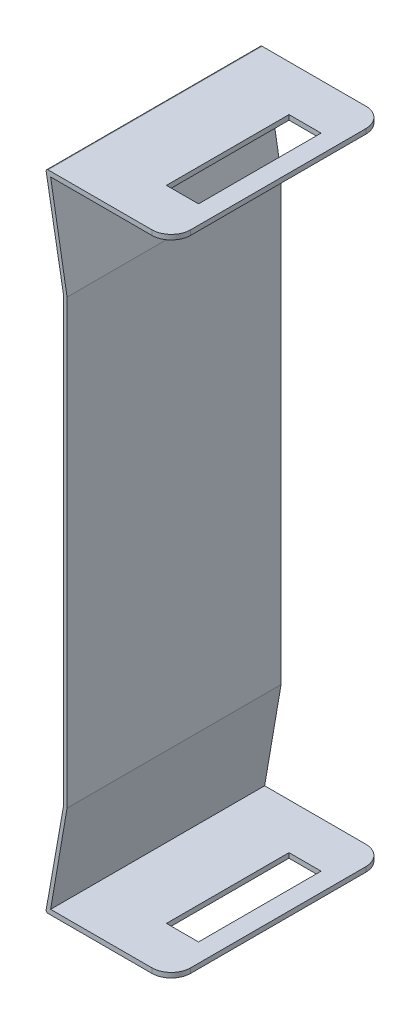
ISO-10303-21;
HEADER;
FILE_DESCRIPTION(('STEP AP214'),'2;1');
FILE_NAME('part.step','',(''),(''),'','','');
FILE_SCHEMA(('AUTOMOTIVE_DESIGN { 1 0 10303 214 1 1 1 1 }'));
ENDSEC;
DATA;
#1=APPLICATION_CONTEXT('core data for automotive mechanical design processes');
#2=APPLICATION_PROTOCOL_DEFINITION('international standard','automotive_design',2000,#1);
#3=PRODUCT_CONTEXT('',#1,'mechanical');
#4=PRODUCT('Part','Part','',(#3));
#5=PRODUCT_RELATED_PRODUCT_CATEGORY('part','',(#4));
#6=PRODUCT_DEFINITION_FORMATION('','',#4);
#7=PRODUCT_DEFINITION_CONTEXT('part definition',#1,'design');
#8=PRODUCT_DEFINITION('design','',#6,#7);
#9=PRODUCT_DEFINITION_SHAPE('','',#8);
#10=(LENGTH_UNIT() NAMED_UNIT(*) SI_UNIT(.MILLI.,.METRE.));
#11=(NAMED_UNIT(*) PLANE_ANGLE_UNIT() SI_UNIT($,.RADIAN.));
#12=(NAMED_UNIT(*) SI_UNIT($,.STERADIAN.) SOLID_ANGLE_UNIT());
#13=UNCERTAINTY_MEASURE_WITH_UNIT(LENGTH_MEASURE(1.E-05),#10,'distance_accuracy_value','');
#14=(GEOMETRIC_REPRESENTATION_CONTEXT(3) GLOBAL_UNCERTAINTY_ASSIGNED_CONTEXT((#13)) GLOBAL_UNIT_ASSIGNED_CONTEXT((#10,
#11,#12)) REPRESENTATION_CONTEXT('',''));
#15=CARTESIAN_POINT('',(0.,0.,0.));
#16=DIRECTION('',(0.,0.,1.));
#17=DIRECTION('',(1.,0.,0.));
#18=AXIS2_PLACEMENT_3D('',#15,#16,#17);
#19=CARTESIAN_POINT('',(-12.661651984145,32.9,0.));
#20=DIRECTION('',(0.,0.,1.));
#21=DIRECTION('',(1.,0.,0.));
#22=AXIS2_PLACEMENT_3D('',#19,#20,#21);
#23=CYLINDRICAL_SURFACE('',#22,0.199999999999999);
#24=CARTESIAN_POINT('',(-12.661651984145,32.9,22.));
#25=DIRECTION('',(0.,0.,1.));
#26=DIRECTION('',(1.,0.,0.));
#27=AXIS2_PLACEMENT_3D('',#24,#25,#26);
#28=CIRCLE('',#27,0.199999999999999);
#29=CARTESIAN_POINT('',(-12.8586135347474,32.8652703644666,22.));
#30=VERTEX_POINT('',#29);
#31=CARTESIAN_POINT('',(-12.661651984145,33.1,22.));
#32=VERTEX_POINT('',#31);
#33=EDGE_CURVE('E208',#30,#32,#28,.F.);
#34=ORIENTED_EDGE('',*,*,#33,.T.);
#35=DIRECTION('',(0.,0.,1.));
#36=VECTOR('',#35,1.);
#37=CARTESIAN_POINT('',(-12.661651984145,33.1,0.));
#38=LINE('',#37,#36);
#39=CARTESIAN_POINT('',(-12.661651984145,33.1,0.));
#40=VERTEX_POINT('',#39);
#41=EDGE_CURVE('E206',#40,#32,#38,.T.);
#42=ORIENTED_EDGE('',*,*,#41,.F.);
#43=CARTESIAN_POINT('',(-12.661651984145,32.9,0.));
#44=DIRECTION('',(0.,0.,1.));
#45=DIRECTION('',(1.,0.,0.));
#46=AXIS2_PLACEMENT_3D('',#43,#44,#45);
#47=CIRCLE('',#46,0.199999999999999);
#48=CARTESIAN_POINT('',(-12.8586135347474,32.8652703644666,0.));
#49=VERTEX_POINT('',#48);
#50=EDGE_CURVE('E19',#40,#49,#47,.T.);
#51=ORIENTED_EDGE('',*,*,#50,.T.);
#52=DIRECTION('',(0.,0.,1.));
#53=VECTOR('',#52,1.);
#54=CARTESIAN_POINT('',(-12.8586135347474,32.8652703644666,0.));
#55=LINE('',#54,#53);
#56=EDGE_CURVE('E203',#30,#49,#55,.F.);
#57=ORIENTED_EDGE('',*,*,#56,.F.);
#58=EDGE_LOOP('',(#34,#42,#51,#57));
#59=FACE_BOUND('',#58,.T.);
#60=ADVANCED_FACE('F16',(#59),#23,.T.);
#61=CARTESIAN_POINT('',(-12.0632825005491,22.595953446496,0.));
#62=DIRECTION('',(0.,0.,1.));
#63=DIRECTION('',(1.,0.,0.));
#64=AXIS2_PLACEMENT_3D('',#61,#62,#63);
#65=CYLINDRICAL_SURFACE('',#64,1.00000000000001);
#66=DIRECTION('',(0.,0.,1.));
#67=VECTOR('',#66,1.);
#68=CARTESIAN_POINT('',(-11.0632825011315,22.5959193173915,0.));
#69=LINE('',#68,#67);
#70=CARTESIAN_POINT('',(-11.0632825011315,22.5959193173915,22.));
#71=VERTEX_POINT('',#70);
#72=CARTESIAN_POINT('',(-11.0632825011315,22.5959193173915,0.));
#73=VERTEX_POINT('',#72);
#74=EDGE_CURVE('E332',#71,#73,#69,.F.);
#75=ORIENTED_EDGE('',*,*,#74,.F.);
#76=CARTESIAN_POINT('',(-12.0632825005491,22.595953446496,22.));
#77=DIRECTION('',(0.,0.,1.));
#78=DIRECTION('',(1.,0.,0.));
#79=AXIS2_PLACEMENT_3D('',#76,#77,#78);
#80=CIRCLE('',#79,1.00000000000001);
#81=CARTESIAN_POINT('',(-11.0784747475368,22.7696016241629,22.));
#82=VERTEX_POINT('',#81);
#83=EDGE_CURVE('E437',#82,#71,#80,.F.);
#84=ORIENTED_EDGE('',*,*,#83,.F.);
#85=DIRECTION('',(0.,0.,1.));
#86=VECTOR('',#85,1.);
#87=CARTESIAN_POINT('',(-11.0784747475368,22.7696016241629,0.));
#88=LINE('',#87,#86);
#89=CARTESIAN_POINT('',(-11.0784747475368,22.7696016241629,0.));
#90=VERTEX_POINT('',#89);
#91=EDGE_CURVE('E217',#90,#82,#88,.T.);
#92=ORIENTED_EDGE('',*,*,#91,.F.);
#93=CARTESIAN_POINT('',(-12.0632825005491,22.595953446496,0.));
#94=DIRECTION('',(0.,0.,1.));
#95=DIRECTION('',(1.,0.,0.));
#96=AXIS2_PLACEMENT_3D('',#93,#94,#95);
#97=CIRCLE('',#96,1.00000000000001);
#98=EDGE_CURVE('E221',#73,#90,#97,.T.);
#99=ORIENTED_EDGE('',*,*,#98,.F.);
#100=EDGE_LOOP('',(#75,#84,#92,#99));
#101=FACE_BOUND('',#100,.T.);
#102=ADVANCED_FACE('F476',(#101),#65,.F.);
#103=CARTESIAN_POINT('',(-12.0648248518323,-22.5957181908065,0.));
#104=DIRECTION('',(0.,0.,1.));
#105=DIRECTION('',(1.,0.,0.));
#106=AXIS2_PLACEMENT_3D('',#103,#104,#105);
#107=CYLINDRICAL_SURFACE('',#106,1.00000000000004);
#108=DIRECTION('',(0.,0.,1.));
#109=VECTOR('',#108,1.);
#110=CARTESIAN_POINT('',(-11.0800170988201,-22.7693663684735,0.));
#111=LINE('',#110,#109);
#112=CARTESIAN_POINT('',(-11.0800170988201,-22.7693663684735,22.));
#113=VERTEX_POINT('',#112);
#114=CARTESIAN_POINT('',(-11.0800170988201,-22.7693663684735,0.));
#115=VERTEX_POINT('',#114);
#116=EDGE_CURVE('E326',#113,#115,#111,.F.);
#117=ORIENTED_EDGE('',*,*,#116,.F.);
#118=CARTESIAN_POINT('',(-12.0648248518323,-22.5957181908065,22.));
#119=DIRECTION('',(0.,0.,1.));
#120=DIRECTION('',(1.,0.,0.));
#121=AXIS2_PLACEMENT_3D('',#118,#119,#120);
#122=CIRCLE('',#121,1.00000000000004);
#123=CARTESIAN_POINT('',(-11.0648248524147,-22.595752319911,22.));
#124=VERTEX_POINT('',#123);
#125=EDGE_CURVE('E434',#124,#113,#122,.F.);
#126=ORIENTED_EDGE('',*,*,#125,.F.);
#127=DIRECTION('',(0.,0.,1.));
#128=VECTOR('',#127,1.);
#129=CARTESIAN_POINT('',(-11.0648248524147,-22.595752319911,0.));
#130=LINE('',#129,#128);
#131=CARTESIAN_POINT('',(-11.0648248524147,-22.595752319911,0.));
#132=VERTEX_POINT('',#131);
#133=EDGE_CURVE('E216',#132,#124,#130,.T.);
#134=ORIENTED_EDGE('',*,*,#133,.F.);
#135=CARTESIAN_POINT('',(-12.0648248518323,-22.5957181908065,0.));
#136=DIRECTION('',(0.,0.,1.));
#137=DIRECTION('',(1.,0.,0.));
#138=AXIS2_PLACEMENT_3D('',#135,#136,#137);
#139=CIRCLE('',#138,1.00000000000004);
#140=EDGE_CURVE('E432',#115,#132,#139,.T.);
#141=ORIENTED_EDGE('',*,*,#140,.F.);
#142=EDGE_LOOP('',(#117,#126,#134,#141));
#143=FACE_BOUND('',#142,.T.);
#144=ADVANCED_FACE('F474',(#143),#107,.F.);
#145=CARTESIAN_POINT('',(-12.6632219073606,-32.8999211125092,0.));
#146=DIRECTION('',(0.,0.,1.));
#147=DIRECTION('',(1.,0.,0.));
#148=AXIS2_PLACEMENT_3D('',#145,#146,#147);
#149=CYLINDRICAL_SURFACE('',#148,0.199999999999996);
#150=CARTESIAN_POINT('',(-12.6632219073606,-32.8999211125092,22.));
#151=DIRECTION('',(0.,0.,1.));
#152=DIRECTION('',(1.,0.,0.));
#153=AXIS2_PLACEMENT_3D('',#150,#151,#152);
#154=CIRCLE('',#153,0.199999999999996);
#155=CARTESIAN_POINT('',(-12.6632219073606,-33.0999211125092,22.));
#156=VERTEX_POINT('',#155);
#157=CARTESIAN_POINT('',(-12.860183457963,-32.8651914769759,22.));
#158=VERTEX_POINT('',#157);
#159=EDGE_CURVE('E412',#156,#158,#154,.F.);
#160=ORIENTED_EDGE('',*,*,#159,.T.);
#161=DIRECTION('',(0.,0.,1.));
#162=VECTOR('',#161,1.);
#163=CARTESIAN_POINT('',(-12.860183457963,-32.8651914769759,0.));
#164=LINE('',#163,#162);
#165=CARTESIAN_POINT('',(-12.860183457963,-32.8651914769759,0.));
#166=VERTEX_POINT('',#165);
#167=EDGE_CURVE('E329',#166,#158,#164,.T.);
#168=ORIENTED_EDGE('',*,*,#167,.F.);
#169=CARTESIAN_POINT('',(-12.6632219073606,-32.8999211125092,0.));
#170=DIRECTION('',(0.,0.,1.));
#171=DIRECTION('',(1.,0.,0.));
#172=AXIS2_PLACEMENT_3D('',#169,#170,#171);
#173=CIRCLE('',#172,0.199999999999996);
#174=CARTESIAN_POINT('',(-12.6632219073606,-33.0999211125092,0.));
#175=VERTEX_POINT('',#174);
#176=EDGE_CURVE('E430',#166,#175,#173,.T.);
#177=ORIENTED_EDGE('',*,*,#176,.T.);
#178=DIRECTION('',(0.,0.,1.));
#179=VECTOR('',#178,1.);
#180=CARTESIAN_POINT('',(-12.6632219073606,-33.0999211125092,0.));
#181=LINE('',#180,#179);
#182=EDGE_CURVE('E322',#156,#175,#181,.F.);
#183=ORIENTED_EDGE('',*,*,#182,.F.);
#184=EDGE_LOOP('',(#160,#168,#177,#183));
#185=FACE_BOUND('',#184,.T.);
#186=ADVANCED_FACE('F462',(#185),#149,.T.);
#187=CARTESIAN_POINT('',(-2.05279802201979,16.2911749298024,2.));
#188=DIRECTION('',(-0.00314032641401706,-0.99999506916285,0.));
#189=DIRECTION('',(0.99999506916285,-0.00314032641401706,0.));
#190=AXIS2_PLACEMENT_3D('',#187,#188,#189);
#191=CYLINDRICAL_SURFACE('',#190,2.);
#192=CARTESIAN_POINT('',(-2.00158248760233,32.6000788874908,2.));
#193=DIRECTION('',(0.,-1.,0.));
#194=DIRECTION('',(-1.,0.,0.));
#195=AXIS2_PLACEMENT_3D('',#192,#193,#194);
#196=ELLIPSE('',#195,2.00000986172293,2.);
#197=CARTESIAN_POINT('',(-2.00158248760234,32.6000788874908,0.));
#198=VERTEX_POINT('',#197);
#199=CARTESIAN_POINT('',(-0.00157262587941043,32.6000788874908,2.));
#200=VERTEX_POINT('',#199);
#201=EDGE_CURVE('E265',#198,#200,#196,.T.);
#202=ORIENTED_EDGE('',*,*,#201,.F.);
#203=DIRECTION('',(-0.00314032641401706,-0.99999506916285,0.));
#204=VECTOR('',#203,1.);
#205=CARTESIAN_POINT('',(-2.0527980220198,16.2911749298024,0.));
#206=LINE('',#205,#204);
#207=CARTESIAN_POINT('',(-2.00001256438676,33.1,0.));
#208=VERTEX_POINT('',#207);
#209=EDGE_CURVE('E410',#198,#208,#206,.F.);
#210=ORIENTED_EDGE('',*,*,#209,.T.);
#211=CARTESIAN_POINT('',(-2.00001256438676,33.1,2.));
#212=DIRECTION('',(0.,1.,0.));
#213=DIRECTION('',(-1.,0.,0.));
#214=AXIS2_PLACEMENT_3D('',#211,#212,#213);
#215=ELLIPSE('',#214,2.00000986172293,2.);
#216=CARTESIAN_POINT('',(-2.702663837192E-06,33.1,2.));
#217=VERTEX_POINT('',#216);
#218=EDGE_CURVE('E355',#217,#208,#215,.T.);
#219=ORIENTED_EDGE('',*,*,#218,.F.);
#220=DIRECTION('',(0.00314032641401706,0.99999506916285,0.));
#221=VECTOR('',#220,1.);
#222=CARTESIAN_POINT('',(-0.0015726258794127,32.6000788874908,2.));
#223=LINE('',#222,#221);
#224=EDGE_CURVE('E407',#200,#217,#223,.T.);
#225=ORIENTED_EDGE('',*,*,#224,.F.);
#226=EDGE_LOOP('',(#202,#210,#219,#225));
#227=FACE_BOUND('',#226,.T.);
#228=ADVANCED_FACE('F483',(#227),#191,.T.);
#229=CARTESIAN_POINT('',(-0.0015726258794127,32.6000788874908,0.));
#230=DIRECTION('',(0.99999506916285,-0.00314032641401706,0.));
#231=DIRECTION('',(0.00314032641401706,0.99999506916285,0.));
#232=AXIS2_PLACEMENT_3D('',#229,#230,#231);
#233=PLANE('',#232);
#234=DIRECTION('',(0.00314032641401706,0.99999506916285,0.));
#235=VECTOR('',#234,1.);
#236=CARTESIAN_POINT('',(-0.0528078836940899,16.2848942769744,20.));
#237=LINE('',#236,#235);
#238=CARTESIAN_POINT('',(-0.001572625879409,32.6000788874908,20.));
#239=VERTEX_POINT('',#238);
#240=CARTESIAN_POINT('',(-2.70266383598084E-06,33.1,20.));
#241=VERTEX_POINT('',#240);
#242=EDGE_CURVE('E403',#239,#241,#237,.T.);
#243=ORIENTED_EDGE('',*,*,#242,.F.);
#244=DIRECTION('',(0.,0.,-1.));
#245=VECTOR('',#244,1.);
#246=CARTESIAN_POINT('',(-0.00157262587941256,32.6000788874908,0.));
#247=LINE('',#246,#245);
#248=EDGE_CURVE('E262',#200,#239,#247,.F.);
#249=ORIENTED_EDGE('',*,*,#248,.F.);
#250=ORIENTED_EDGE('',*,*,#224,.T.);
#251=DIRECTION('',(0.,0.,1.));
#252=VECTOR('',#251,1.);
#253=CARTESIAN_POINT('',(-2.70266383939344E-06,33.1,0.));
#254=LINE('',#253,#252);
#255=EDGE_CURVE('E350',#241,#217,#254,.F.);
#256=ORIENTED_EDGE('',*,*,#255,.F.);
#257=EDGE_LOOP('',(#243,#249,#250,#256));
#258=FACE_BOUND('',#257,.T.);
#259=ADVANCED_FACE('F573',(#258),#233,.T.);
#260=CARTESIAN_POINT('',(-2.05279802201979,16.2911749298024,20.));
#261=DIRECTION('',(0.00314032641401706,0.99999506916285,0.));
#262=DIRECTION('',(-0.99999506916285,0.00314032641401706,0.));
#263=AXIS2_PLACEMENT_3D('',#260,#261,#262);
#264=CYLINDRICAL_SURFACE('',#263,2.);
#265=CARTESIAN_POINT('',(-2.00158248760233,32.6000788874908,20.));
#266=DIRECTION('',(0.,-1.,0.));
#267=DIRECTION('',(1.,0.,0.));
#268=AXIS2_PLACEMENT_3D('',#265,#266,#267);
#269=ELLIPSE('',#268,2.00000986172293,2.);
#270=CARTESIAN_POINT('',(-2.00158248760234,32.6000788874908,22.));
#271=VERTEX_POINT('',#270);
#272=EDGE_CURVE('E261',#239,#271,#269,.T.);
#273=ORIENTED_EDGE('',*,*,#272,.F.);
#274=ORIENTED_EDGE('',*,*,#242,.T.);
#275=CARTESIAN_POINT('',(-2.00001256438676,33.1,20.));
#276=DIRECTION('',(0.,1.,0.));
#277=DIRECTION('',(1.,0.,0.));
#278=AXIS2_PLACEMENT_3D('',#275,#276,#277);
#279=ELLIPSE('',#278,2.00000986172293,2.);
#280=CARTESIAN_POINT('',(-2.00001256438677,33.1,22.));
#281=VERTEX_POINT('',#280);
#282=EDGE_CURVE('E353',#281,#241,#279,.T.);
#283=ORIENTED_EDGE('',*,*,#282,.F.);
#284=DIRECTION('',(0.00314032641401706,0.99999506916285,0.));
#285=VECTOR('',#284,1.);
#286=CARTESIAN_POINT('',(-2.0527980220198,16.2911749298024,22.));
#287=LINE('',#286,#285);
#288=EDGE_CURVE('E405',#281,#271,#287,.F.);
#289=ORIENTED_EDGE('',*,*,#288,.T.);
#290=EDGE_LOOP('',(#273,#274,#283,#289));
#291=FACE_BOUND('',#290,.T.);
#292=ADVANCED_FACE('F569',(#291),#264,.T.);
#293=CARTESIAN_POINT('',(-5.20000270266382,-33.0999211125092,4.7));
#294=DIRECTION('',(-1.,0.,0.));
#295=DIRECTION('',(0.,-1.,0.));
#296=AXIS2_PLACEMENT_3D('',#293,#294,#295);
#297=PLANE('',#296);
#298=DIRECTION('',(0.,1.,0.));
#299=VECTOR('',#298,1.);
#300=CARTESIAN_POINT('',(-5.20000270266384,-33.0999211125092,17.3));
#301=LINE('',#300,#299);
#302=CARTESIAN_POINT('',(-5.20000270266384,33.1,17.3));
#303=VERTEX_POINT('',#302);
#304=CARTESIAN_POINT('',(-5.20000270266384,32.6000788874908,17.3));
#305=VERTEX_POINT('',#304);
#306=EDGE_CURVE('E401',#303,#305,#301,.F.);
#307=ORIENTED_EDGE('',*,*,#306,.T.);
#308=DIRECTION('',(0.,0.,-1.));
#309=VECTOR('',#308,1.);
#310=CARTESIAN_POINT('',(-5.20000270266384,32.6000788874908,0.));
#311=LINE('',#310,#309);
#312=CARTESIAN_POINT('',(-5.20000270266384,32.6000788874908,4.7));
#313=VERTEX_POINT('',#312);
#314=EDGE_CURVE('E258',#313,#305,#311,.F.);
#315=ORIENTED_EDGE('',*,*,#314,.F.);
#316=DIRECTION('',(0.,1.,0.));
#317=VECTOR('',#316,1.);
#318=CARTESIAN_POINT('',(-5.20000270266384,-33.0999211125092,4.7));
#319=LINE('',#318,#317);
#320=CARTESIAN_POINT('',(-5.20000270266384,33.1,4.7));
#321=VERTEX_POINT('',#320);
#322=EDGE_CURVE('E395',#313,#321,#319,.T.);
#323=ORIENTED_EDGE('',*,*,#322,.T.);
#324=DIRECTION('',(0.,0.,1.));
#325=VECTOR('',#324,1.);
#326=CARTESIAN_POINT('',(-5.20000270266384,33.1,0.));
#327=LINE('',#326,#325);
#328=EDGE_CURVE('E347',#303,#321,#327,.F.);
#329=ORIENTED_EDGE('',*,*,#328,.F.);
#330=EDGE_LOOP('',(#307,#315,#323,#329));
#331=FACE_BOUND('',#330,.T.);
#332=ADVANCED_FACE('F565',(#331),#297,.F.);
#333=CARTESIAN_POINT('',(-5.20000270266381,-33.0999211125092,17.3));
#334=DIRECTION('',(0.,0.,1.));
#335=DIRECTION('',(1.,0.,0.));
#336=AXIS2_PLACEMENT_3D('',#333,#334,#335);
#337=PLANE('',#336);
#338=DIRECTION('',(0.,1.,0.));
#339=VECTOR('',#338,1.);
#340=CARTESIAN_POINT('',(-1.90000270266382,-33.0999211125092,17.3));
#341=LINE('',#340,#339);
#342=CARTESIAN_POINT('',(-1.90000270266384,33.1,17.3));
#343=VERTEX_POINT('',#342);
#344=CARTESIAN_POINT('',(-1.90000270266384,32.6000788874908,17.3));
#345=VERTEX_POINT('',#344);
#346=EDGE_CURVE('E399',#343,#345,#341,.F.);
#347=ORIENTED_EDGE('',*,*,#346,.T.);
#348=DIRECTION('',(1.,0.,0.));
#349=VECTOR('',#348,1.);
#350=CARTESIAN_POINT('',(-12.4015726258794,32.6000788874908,17.3));
#351=LINE('',#350,#349);
#352=EDGE_CURVE('E255',#305,#345,#351,.T.);
#353=ORIENTED_EDGE('',*,*,#352,.F.);
#354=ORIENTED_EDGE('',*,*,#306,.F.);
#355=DIRECTION('',(-1.,0.,0.));
#356=VECTOR('',#355,1.);
#357=CARTESIAN_POINT('',(-2.70266383939344E-06,33.1,17.3));
#358=LINE('',#357,#356);
#359=EDGE_CURVE('E338',#343,#303,#358,.T.);
#360=ORIENTED_EDGE('',*,*,#359,.F.);
#361=EDGE_LOOP('',(#347,#353,#354,#360));
#362=FACE_BOUND('',#361,.T.);
#363=ADVANCED_FACE('F561',(#362),#337,.F.);
#364=CARTESIAN_POINT('',(-1.90000270266382,-33.0999211125092,17.3));
#365=DIRECTION('',(1.,0.,0.));
#366=DIRECTION('',(0.,1.,0.));
#367=AXIS2_PLACEMENT_3D('',#364,#365,#366);
#368=PLANE('',#367);
#369=DIRECTION('',(0.,1.,0.));
#370=VECTOR('',#369,1.);
#371=CARTESIAN_POINT('',(-1.90000270266384,-33.0999211125092,4.7));
#372=LINE('',#371,#370);
#373=CARTESIAN_POINT('',(-1.90000270266384,33.1,4.7));
#374=VERTEX_POINT('',#373);
#375=CARTESIAN_POINT('',(-1.90000270266384,32.6000788874908,4.7));
#376=VERTEX_POINT('',#375);
#377=EDGE_CURVE('E397',#374,#376,#372,.F.);
#378=ORIENTED_EDGE('',*,*,#377,.T.);
#379=DIRECTION('',(0.,0.,-1.));
#380=VECTOR('',#379,1.);
#381=CARTESIAN_POINT('',(-1.90000270266384,32.6000788874908,0.));
#382=LINE('',#381,#380);
#383=EDGE_CURVE('E252',#345,#376,#382,.T.);
#384=ORIENTED_EDGE('',*,*,#383,.F.);
#385=ORIENTED_EDGE('',*,*,#346,.F.);
#386=DIRECTION('',(0.,0.,1.));
#387=VECTOR('',#386,1.);
#388=CARTESIAN_POINT('',(-1.90000270266384,33.1,0.));
#389=LINE('',#388,#387);
#390=EDGE_CURVE('E341',#374,#343,#389,.T.);
#391=ORIENTED_EDGE('',*,*,#390,.F.);
#392=EDGE_LOOP('',(#378,#384,#385,#391));
#393=FACE_BOUND('',#392,.T.);
#394=ADVANCED_FACE('F557',(#393),#368,.F.);
#395=CARTESIAN_POINT('',(-1.90000270266382,-33.0999211125092,4.7));
#396=DIRECTION('',(0.,0.,-1.));
#397=DIRECTION('',(-1.,0.,0.));
#398=AXIS2_PLACEMENT_3D('',#395,#396,#397);
#399=PLANE('',#398);
#400=ORIENTED_EDGE('',*,*,#322,.F.);
#401=DIRECTION('',(1.,0.,0.));
#402=VECTOR('',#401,1.);
#403=CARTESIAN_POINT('',(-12.4015726258794,32.6000788874908,4.7));
#404=LINE('',#403,#402);
#405=EDGE_CURVE('E249',#376,#313,#404,.F.);
#406=ORIENTED_EDGE('',*,*,#405,.F.);
#407=ORIENTED_EDGE('',*,*,#377,.F.);
#408=DIRECTION('',(-1.,0.,0.));
#409=VECTOR('',#408,1.);
#410=CARTESIAN_POINT('',(-2.70266383939344E-06,33.1,4.7));
#411=LINE('',#410,#409);
#412=EDGE_CURVE('E344',#321,#374,#411,.F.);
#413=ORIENTED_EDGE('',*,*,#412,.F.);
#414=EDGE_LOOP('',(#400,#406,#407,#413));
#415=FACE_BOUND('',#414,.T.);
#416=ADVANCED_FACE('F553',(#415),#399,.F.);
#417=CARTESIAN_POINT('',(-2.00157262587941,-16.5499391321616,20.));
#418=DIRECTION('',(0.,1.,0.));
#419=DIRECTION('',(-1.,0.,0.));
#420=AXIS2_PLACEMENT_3D('',#417,#418,#419);
#421=CYLINDRICAL_SURFACE('',#420,2.);
#422=CARTESIAN_POINT('',(-2.00157262587941,-32.5999211125092,20.));
#423=DIRECTION('',(0.,1.,0.));
#424=DIRECTION('',(-1.,0.,0.));
#425=AXIS2_PLACEMENT_3D('',#422,#423,#424);
#426=CIRCLE('',#425,2.);
#427=CARTESIAN_POINT('',(-2.0015726258794,-32.5999211125092,22.));
#428=VERTEX_POINT('',#427);
#429=CARTESIAN_POINT('',(-0.00157262587940474,-32.5999211125092,20.));
#430=VERTEX_POINT('',#429);
#431=EDGE_CURVE('E248',#428,#430,#426,.T.);
#432=ORIENTED_EDGE('',*,*,#431,.F.);
#433=DIRECTION('',(0.,1.,0.));
#434=VECTOR('',#433,1.);
#435=CARTESIAN_POINT('',(-2.0015726258794,-16.5499391321616,22.));
#436=LINE('',#435,#434);
#437=CARTESIAN_POINT('',(-2.0015726258794,-33.0999211125092,22.));
#438=VERTEX_POINT('',#437);
#439=EDGE_CURVE('E393',#428,#438,#436,.F.);
#440=ORIENTED_EDGE('',*,*,#439,.T.);
#441=CARTESIAN_POINT('',(-2.00157262587941,-33.0999211125092,20.));
#442=DIRECTION('',(0.,1.,0.));
#443=DIRECTION('',(-1.,0.,0.));
#444=AXIS2_PLACEMENT_3D('',#441,#442,#443);
#445=CIRCLE('',#444,2.);
#446=CARTESIAN_POINT('',(-0.00157262587940451,-33.0999211125092,20.));
#447=VERTEX_POINT('',#446);
#448=EDGE_CURVE('E325',#447,#438,#445,.F.);
#449=ORIENTED_EDGE('',*,*,#448,.F.);
#450=DIRECTION('',(0.,1.,0.));
#451=VECTOR('',#450,1.);
#452=CARTESIAN_POINT('',(-0.00157262587940465,-33.0999211125092,20.));
#453=LINE('',#452,#451);
#454=EDGE_CURVE('E389',#430,#447,#453,.F.);
#455=ORIENTED_EDGE('',*,*,#454,.F.);
#456=EDGE_LOOP('',(#432,#440,#449,#455));
#457=FACE_BOUND('',#456,.T.);
#458=ADVANCED_FACE('F549',(#457),#421,.T.);
#459=CARTESIAN_POINT('',(-0.00157262587940465,-33.0999211125092,0.));
#460=DIRECTION('',(1.,0.,0.));
#461=DIRECTION('',(0.,1.,0.));
#462=AXIS2_PLACEMENT_3D('',#459,#460,#461);
#463=PLANE('',#462);
#464=DIRECTION('',(0.,-1.,0.));
#465=VECTOR('',#464,1.);
#466=CARTESIAN_POINT('',(-0.00157262587940996,-16.5499391321616,2.));
#467=LINE('',#466,#465);
#468=CARTESIAN_POINT('',(-0.00157262587940628,-32.5999211125092,2.));
#469=VERTEX_POINT('',#468);
#470=CARTESIAN_POINT('',(-0.0015726258794049,-33.0999211125092,2.));
#471=VERTEX_POINT('',#470);
#472=EDGE_CURVE('E386',#469,#471,#467,.T.);
#473=ORIENTED_EDGE('',*,*,#472,.F.);
#474=DIRECTION('',(0.,0.,1.));
#475=VECTOR('',#474,1.);
#476=CARTESIAN_POINT('',(-0.00157262587940472,-32.5999211125092,0.));
#477=LINE('',#476,#475);
#478=EDGE_CURVE('E245',#430,#469,#477,.F.);
#479=ORIENTED_EDGE('',*,*,#478,.F.);
#480=ORIENTED_EDGE('',*,*,#454,.T.);
#481=DIRECTION('',(0.,0.,1.));
#482=VECTOR('',#481,1.);
#483=CARTESIAN_POINT('',(-0.00157262587940389,-33.0999211125092,0.));
#484=LINE('',#483,#482);
#485=EDGE_CURVE('E318',#471,#447,#484,.T.);
#486=ORIENTED_EDGE('',*,*,#485,.F.);
#487=EDGE_LOOP('',(#473,#479,#480,#486));
#488=FACE_BOUND('',#487,.T.);
#489=ADVANCED_FACE('F545',(#488),#463,.T.);
#490=CARTESIAN_POINT('',(-2.00157262587941,-16.5499391321616,2.));
#491=DIRECTION('',(0.,-1.,0.));
#492=DIRECTION('',(1.,0.,0.));
#493=AXIS2_PLACEMENT_3D('',#490,#491,#492);
#494=CYLINDRICAL_SURFACE('',#493,2.);
#495=CARTESIAN_POINT('',(-2.00157262587941,-32.5999211125092,2.));
#496=DIRECTION('',(0.,-1.,0.));
#497=DIRECTION('',(1.,0.,0.));
#498=AXIS2_PLACEMENT_3D('',#495,#496,#497);
#499=CIRCLE('',#498,2.);
#500=CARTESIAN_POINT('',(-2.00157262587941,-32.5999211125092,0.));
#501=VERTEX_POINT('',#500);
#502=EDGE_CURVE('E244',#469,#501,#499,.F.);
#503=ORIENTED_EDGE('',*,*,#502,.F.);
#504=ORIENTED_EDGE('',*,*,#472,.T.);
#505=CARTESIAN_POINT('',(-2.00157262587941,-33.0999211125092,2.));
#506=DIRECTION('',(0.,-1.,0.));
#507=DIRECTION('',(1.,0.,0.));
#508=AXIS2_PLACEMENT_3D('',#505,#506,#507);
#509=CIRCLE('',#508,2.);
#510=CARTESIAN_POINT('',(-2.00157262587941,-33.0999211125092,0.));
#511=VERTEX_POINT('',#510);
#512=EDGE_CURVE('E321',#511,#471,#509,.T.);
#513=ORIENTED_EDGE('',*,*,#512,.F.);
#514=DIRECTION('',(0.,-1.,0.));
#515=VECTOR('',#514,1.);
#516=CARTESIAN_POINT('',(-2.00157262587941,-16.5499391321616,0.));
#517=LINE('',#516,#515);
#518=EDGE_CURVE('E387',#511,#501,#517,.F.);
#519=ORIENTED_EDGE('',*,*,#518,.T.);
#520=EDGE_LOOP('',(#503,#504,#513,#519));
#521=FACE_BOUND('',#520,.T.);
#522=ADVANCED_FACE('F541',(#521),#494,.T.);
#523=CARTESIAN_POINT('',(-5.20000270266382,-33.0999211125092,4.7));
#524=DIRECTION('',(-1.,0.,0.));
#525=DIRECTION('',(0.,-1.,0.));
#526=AXIS2_PLACEMENT_3D('',#523,#524,#525);
#527=PLANE('',#526);
#528=DIRECTION('',(0.,1.,0.));
#529=VECTOR('',#528,1.);
#530=CARTESIAN_POINT('',(-5.20000270266381,-33.0999211125092,17.3));
#531=LINE('',#530,#529);
#532=CARTESIAN_POINT('',(-5.20000270266381,-32.5999211125092,17.3));
#533=VERTEX_POINT('',#532);
#534=CARTESIAN_POINT('',(-5.20000270266382,-33.0999211125092,17.3));
#535=VERTEX_POINT('',#534);
#536=EDGE_CURVE('E380',#533,#535,#531,.F.);
#537=ORIENTED_EDGE('',*,*,#536,.T.);
#538=DIRECTION('',(0.,0.,1.));
#539=VECTOR('',#538,1.);
#540=CARTESIAN_POINT('',(-5.20000270266382,-33.0999211125092,0.));
#541=LINE('',#540,#539);
#542=CARTESIAN_POINT('',(-5.20000270266382,-33.0999211125092,4.7));
#543=VERTEX_POINT('',#542);
#544=EDGE_CURVE('E315',#543,#535,#541,.T.);
#545=ORIENTED_EDGE('',*,*,#544,.F.);
#546=DIRECTION('',(0.,1.,0.));
#547=VECTOR('',#546,1.);
#548=CARTESIAN_POINT('',(-5.20000270266382,-33.0999211125092,4.7));
#549=LINE('',#548,#547);
#550=CARTESIAN_POINT('',(-5.20000270266382,-32.5999211125092,4.7));
#551=VERTEX_POINT('',#550);
#552=EDGE_CURVE('E384',#543,#551,#549,.T.);
#553=ORIENTED_EDGE('',*,*,#552,.T.);
#554=DIRECTION('',(0.,0.,1.));
#555=VECTOR('',#554,1.);
#556=CARTESIAN_POINT('',(-5.20000270266381,-32.5999211125092,0.));
#557=LINE('',#556,#555);
#558=EDGE_CURVE('E241',#533,#551,#557,.F.);
#559=ORIENTED_EDGE('',*,*,#558,.F.);
#560=EDGE_LOOP('',(#537,#545,#553,#559));
#561=FACE_BOUND('',#560,.T.);
#562=ADVANCED_FACE('F537',(#561),#527,.F.);
#563=CARTESIAN_POINT('',(-1.90000270266382,-33.0999211125092,4.7));
#564=DIRECTION('',(0.,0.,-1.));
#565=DIRECTION('',(-1.,0.,0.));
#566=AXIS2_PLACEMENT_3D('',#563,#564,#565);
#567=PLANE('',#566);
#568=ORIENTED_EDGE('',*,*,#552,.F.);
#569=DIRECTION('',(1.,0.,0.));
#570=VECTOR('',#569,1.);
#571=CARTESIAN_POINT('',(-12.6632219073606,-33.0999211125092,4.7));
#572=LINE('',#571,#570);
#573=CARTESIAN_POINT('',(-1.90000270266382,-33.0999211125092,4.7));
#574=VERTEX_POINT('',#573);
#575=EDGE_CURVE('E306',#574,#543,#572,.F.);
#576=ORIENTED_EDGE('',*,*,#575,.F.);
#577=DIRECTION('',(0.,1.,0.));
#578=VECTOR('',#577,1.);
#579=CARTESIAN_POINT('',(-1.90000270266382,-33.0999211125092,4.7));
#580=LINE('',#579,#578);
#581=CARTESIAN_POINT('',(-1.90000270266382,-32.5999211125092,4.7));
#582=VERTEX_POINT('',#581);
#583=EDGE_CURVE('E382',#574,#582,#580,.T.);
#584=ORIENTED_EDGE('',*,*,#583,.T.);
#585=DIRECTION('',(-1.,0.,0.));
#586=VECTOR('',#585,1.);
#587=CARTESIAN_POINT('',(-0.00157262587940465,-32.5999211125092,4.7));
#588=LINE('',#587,#586);
#589=EDGE_CURVE('E238',#551,#582,#588,.F.);
#590=ORIENTED_EDGE('',*,*,#589,.F.);
#591=EDGE_LOOP('',(#568,#576,#584,#590));
#592=FACE_BOUND('',#591,.T.);
#593=ADVANCED_FACE('F533',(#592),#567,.F.);
#594=CARTESIAN_POINT('',(-1.90000270266382,-33.0999211125092,17.3));
#595=DIRECTION('',(1.,0.,0.));
#596=DIRECTION('',(0.,1.,0.));
#597=AXIS2_PLACEMENT_3D('',#594,#595,#596);
#598=PLANE('',#597);
#599=ORIENTED_EDGE('',*,*,#583,.F.);
#600=DIRECTION('',(0.,0.,1.));
#601=VECTOR('',#600,1.);
#602=CARTESIAN_POINT('',(-1.90000270266382,-33.0999211125092,0.));
#603=LINE('',#602,#601);
#604=CARTESIAN_POINT('',(-1.90000270266382,-33.0999211125092,17.3));
#605=VERTEX_POINT('',#604);
#606=EDGE_CURVE('E309',#605,#574,#603,.F.);
#607=ORIENTED_EDGE('',*,*,#606,.F.);
#608=DIRECTION('',(0.,1.,0.));
#609=VECTOR('',#608,1.);
#610=CARTESIAN_POINT('',(-1.90000270266382,-33.0999211125092,17.3));
#611=LINE('',#610,#609);
#612=CARTESIAN_POINT('',(-1.90000270266382,-32.5999211125092,17.3));
#613=VERTEX_POINT('',#612);
#614=EDGE_CURVE('E378',#605,#613,#611,.T.);
#615=ORIENTED_EDGE('',*,*,#614,.T.);
#616=DIRECTION('',(0.,0.,1.));
#617=VECTOR('',#616,1.);
#618=CARTESIAN_POINT('',(-1.90000270266382,-32.5999211125092,0.));
#619=LINE('',#618,#617);
#620=EDGE_CURVE('E235',#582,#613,#619,.T.);
#621=ORIENTED_EDGE('',*,*,#620,.F.);
#622=EDGE_LOOP('',(#599,#607,#615,#621));
#623=FACE_BOUND('',#622,.T.);
#624=ADVANCED_FACE('F529',(#623),#598,.F.);
#625=CARTESIAN_POINT('',(-5.20000270266381,-33.0999211125092,17.3));
#626=DIRECTION('',(0.,0.,1.));
#627=DIRECTION('',(1.,0.,0.));
#628=AXIS2_PLACEMENT_3D('',#625,#626,#627);
#629=PLANE('',#628);
#630=ORIENTED_EDGE('',*,*,#614,.F.);
#631=DIRECTION('',(1.,0.,0.));
#632=VECTOR('',#631,1.);
#633=CARTESIAN_POINT('',(-12.6632219073606,-33.0999211125092,17.3));
#634=LINE('',#633,#632);
#635=EDGE_CURVE('E312',#535,#605,#634,.T.);
#636=ORIENTED_EDGE('',*,*,#635,.F.);
#637=ORIENTED_EDGE('',*,*,#536,.F.);
#638=DIRECTION('',(-1.,0.,0.));
#639=VECTOR('',#638,1.);
#640=CARTESIAN_POINT('',(-0.00157262587940465,-32.5999211125092,17.3));
#641=LINE('',#640,#639);
#642=EDGE_CURVE('E229',#613,#533,#641,.T.);
#643=ORIENTED_EDGE('',*,*,#642,.F.);
#644=EDGE_LOOP('',(#630,#636,#637,#643));
#645=FACE_BOUND('',#644,.T.);
#646=ADVANCED_FACE('F525',(#645),#629,.F.);
#647=CARTESIAN_POINT('',(-2.70266383939344E-06,33.1,0.));
#648=DIRECTION('',(0.,1.,0.));
#649=DIRECTION('',(-1.,0.,0.));
#650=AXIS2_PLACEMENT_3D('',#647,#648,#649);
#651=PLANE('',#650);
#652=ORIENTED_EDGE('',*,*,#390,.T.);
#653=ORIENTED_EDGE('',*,*,#359,.T.);
#654=ORIENTED_EDGE('',*,*,#328,.T.);
#655=ORIENTED_EDGE('',*,*,#412,.T.);
#656=EDGE_LOOP('',(#652,#653,#654,#655));
#657=FACE_BOUND('',#656,.T.);
#658=ORIENTED_EDGE('',*,*,#282,.T.);
#659=ORIENTED_EDGE('',*,*,#255,.T.);
#660=ORIENTED_EDGE('',*,*,#218,.T.);
#661=DIRECTION('',(1.,0.,0.));
#662=VECTOR('',#661,1.);
#663=CARTESIAN_POINT('',(-9.76324035889157,33.1,0.));
#664=LINE('',#663,#662);
#665=EDGE_CURVE('E224',#208,#40,#664,.F.);
#666=ORIENTED_EDGE('',*,*,#665,.T.);
#667=ORIENTED_EDGE('',*,*,#41,.T.);
#668=DIRECTION('',(1.,0.,0.));
#669=VECTOR('',#668,1.);
#670=CARTESIAN_POINT('',(-9.76324035889157,33.1,22.));
#671=LINE('',#670,#669);
#672=EDGE_CURVE('E280',#281,#32,#671,.F.);
#673=ORIENTED_EDGE('',*,*,#672,.F.);
#674=EDGE_LOOP('',(#658,#659,#660,#666,#667,#673));
#675=FACE_BOUND('',#674,.T.);
#676=ADVANCED_FACE('F441',(#657,#675),#651,.T.);
#677=CARTESIAN_POINT('',(-12.8586135347474,32.8652703644666,0.));
#678=DIRECTION('',(-0.984807753012208,-0.173648177666931,0.));
#679=DIRECTION('',(0.173648177666931,-0.984807753012208,0.));
#680=AXIS2_PLACEMENT_3D('',#677,#678,#679);
#681=PLANE('',#680);
#682=DIRECTION('',(0.173648177666932,-0.984807753012208,0.));
#683=VECTOR('',#682,1.);
#684=CARTESIAN_POINT('',(-12.8586135347474,32.8652703644666,22.));
#685=LINE('',#684,#683);
#686=EDGE_CURVE('E215',#30,#82,#685,.T.);
#687=ORIENTED_EDGE('',*,*,#686,.F.);
#688=ORIENTED_EDGE('',*,*,#56,.T.);
#689=DIRECTION('',(0.173648177666932,-0.984807753012208,0.));
#690=VECTOR('',#689,1.);
#691=CARTESIAN_POINT('',(-12.8586135347474,32.8652703644666,0.));
#692=LINE('',#691,#690);
#693=EDGE_CURVE('E213',#49,#90,#692,.T.);
#694=ORIENTED_EDGE('',*,*,#693,.T.);
#695=ORIENTED_EDGE('',*,*,#91,.T.);
#696=EDGE_LOOP('',(#687,#688,#694,#695));
#697=FACE_BOUND('',#696,.T.);
#698=ADVANCED_FACE('F211',(#697),#681,.T.);
#699=CARTESIAN_POINT('',(-11.0632825011315,22.5959193173915,0.));
#700=DIRECTION('',(-0.999999999417602,3.41291044665006E-05,0.));
#701=DIRECTION('',(-3.41291044665006E-05,-0.999999999417602,0.));
#702=AXIS2_PLACEMENT_3D('',#699,#700,#701);
#703=PLANE('',#702);
#704=DIRECTION('',(-3.4129104465994E-05,-0.999999999417602,0.));
#705=VECTOR('',#704,1.);
#706=CARTESIAN_POINT('',(-11.0632825011315,22.5959193173915,22.));
#707=LINE('',#706,#705);
#708=EDGE_CURVE('E445',#71,#124,#707,.T.);
#709=ORIENTED_EDGE('',*,*,#708,.F.);
#710=ORIENTED_EDGE('',*,*,#74,.T.);
#711=DIRECTION('',(-3.4129104465994E-05,-0.999999999417602,0.));
#712=VECTOR('',#711,1.);
#713=CARTESIAN_POINT('',(-11.0632825011315,22.5959193173915,0.));
#714=LINE('',#713,#712);
#715=EDGE_CURVE('E223',#73,#132,#714,.T.);
#716=ORIENTED_EDGE('',*,*,#715,.T.);
#717=ORIENTED_EDGE('',*,*,#133,.T.);
#718=EDGE_LOOP('',(#709,#710,#716,#717));
#719=FACE_BOUND('',#718,.T.);
#720=ADVANCED_FACE('F472',(#719),#703,.T.);
#721=CARTESIAN_POINT('',(-11.0800170988201,-22.7693663684735,0.));
#722=DIRECTION('',(-0.984807753012208,0.17364817766693,0.));
#723=DIRECTION('',(-0.17364817766693,-0.984807753012208,0.));
#724=AXIS2_PLACEMENT_3D('',#721,#722,#723);
#725=PLANE('',#724);
#726=DIRECTION('',(-0.173648177666928,-0.984807753012208,0.));
#727=VECTOR('',#726,1.);
#728=CARTESIAN_POINT('',(-11.0800170988201,-22.7693663684735,22.));
#729=LINE('',#728,#727);
#730=EDGE_CURVE('E465',#113,#158,#729,.T.);
#731=ORIENTED_EDGE('',*,*,#730,.F.);
#732=ORIENTED_EDGE('',*,*,#116,.T.);
#733=DIRECTION('',(-0.173648177666926,-0.984807753012209,0.));
#734=VECTOR('',#733,1.);
#735=CARTESIAN_POINT('',(-11.0800170988201,-22.7693663684735,0.));
#736=LINE('',#735,#734);
#737=EDGE_CURVE('E227',#115,#166,#736,.T.);
#738=ORIENTED_EDGE('',*,*,#737,.T.);
#739=ORIENTED_EDGE('',*,*,#167,.T.);
#740=EDGE_LOOP('',(#731,#732,#738,#739));
#741=FACE_BOUND('',#740,.T.);
#742=ADVANCED_FACE('F454',(#741),#725,.T.);
#743=CARTESIAN_POINT('',(-12.6632219073606,-33.0999211125092,0.));
#744=DIRECTION('',(0.,-1.,0.));
#745=DIRECTION('',(1.,0.,0.));
#746=AXIS2_PLACEMENT_3D('',#743,#744,#745);
#747=PLANE('',#746);
#748=ORIENTED_EDGE('',*,*,#606,.T.);
#749=ORIENTED_EDGE('',*,*,#575,.T.);
#750=ORIENTED_EDGE('',*,*,#544,.T.);
#751=ORIENTED_EDGE('',*,*,#635,.T.);
#752=EDGE_LOOP('',(#748,#749,#750,#751));
#753=FACE_BOUND('',#752,.T.);
#754=ORIENTED_EDGE('',*,*,#512,.T.);
#755=ORIENTED_EDGE('',*,*,#485,.T.);
#756=ORIENTED_EDGE('',*,*,#448,.T.);
#757=DIRECTION('',(1.,0.,0.));
#758=VECTOR('',#757,1.);
#759=CARTESIAN_POINT('',(-9.76324035889157,-33.0999211125092,22.));
#760=LINE('',#759,#758);
#761=EDGE_CURVE('E295',#156,#438,#760,.T.);
#762=ORIENTED_EDGE('',*,*,#761,.F.);
#763=ORIENTED_EDGE('',*,*,#182,.T.);
#764=DIRECTION('',(1.,0.,0.));
#765=VECTOR('',#764,1.);
#766=CARTESIAN_POINT('',(-9.76324035889157,-33.0999211125092,0.));
#767=LINE('',#766,#765);
#768=EDGE_CURVE('E371',#175,#511,#767,.T.);
#769=ORIENTED_EDGE('',*,*,#768,.T.);
#770=EDGE_LOOP('',(#754,#755,#756,#762,#763,#769));
#771=FACE_BOUND('',#770,.T.);
#772=ADVANCED_FACE('F512',(#753,#771),#747,.T.);
#773=CARTESIAN_POINT('',(-12.4015726258794,32.6000788874908,0.));
#774=DIRECTION('',(0.,-1.,0.));
#775=DIRECTION('',(0.,0.,-1.));
#776=AXIS2_PLACEMENT_3D('',#773,#774,#775);
#777=PLANE('',#776);
#778=ORIENTED_EDGE('',*,*,#383,.T.);
#779=ORIENTED_EDGE('',*,*,#405,.T.);
#780=ORIENTED_EDGE('',*,*,#314,.T.);
#781=ORIENTED_EDGE('',*,*,#352,.T.);
#782=EDGE_LOOP('',(#778,#779,#780,#781));
#783=FACE_BOUND('',#782,.T.);
#784=DIRECTION('',(0.,0.,1.));
#785=VECTOR('',#784,1.);
#786=CARTESIAN_POINT('',(-12.4015726258794,32.6000788874908,0.));
#787=LINE('',#786,#785);
#788=CARTESIAN_POINT('',(-12.4015726258794,32.6000788874908,0.));
#789=VERTEX_POINT('',#788);
#790=CARTESIAN_POINT('',(-12.4015726258794,32.6000788874908,22.));
#791=VERTEX_POINT('',#790);
#792=EDGE_CURVE('E278',#789,#791,#787,.T.);
#793=ORIENTED_EDGE('',*,*,#792,.F.);
#794=DIRECTION('',(1.,0.,0.));
#795=VECTOR('',#794,1.);
#796=CARTESIAN_POINT('',(-9.76324035889157,32.6000788874908,0.));
#797=LINE('',#796,#795);
#798=EDGE_CURVE('E358',#789,#198,#797,.T.);
#799=ORIENTED_EDGE('',*,*,#798,.T.);
#800=ORIENTED_EDGE('',*,*,#201,.T.);
#801=ORIENTED_EDGE('',*,*,#248,.T.);
#802=ORIENTED_EDGE('',*,*,#272,.T.);
#803=DIRECTION('',(1.,0.,0.));
#804=VECTOR('',#803,1.);
#805=CARTESIAN_POINT('',(-9.76324035889157,32.6000788874908,22.));
#806=LINE('',#805,#804);
#807=EDGE_CURVE('E266',#791,#271,#806,.T.);
#808=ORIENTED_EDGE('',*,*,#807,.F.);
#809=EDGE_LOOP('',(#793,#799,#800,#801,#802,#808));
#810=FACE_BOUND('',#809,.T.);
#811=ADVANCED_FACE('F508',(#783,#810),#777,.T.);
#812=CARTESIAN_POINT('',(-0.00157262587940465,-32.5999211125092,0.));
#813=DIRECTION('',(0.,1.,0.));
#814=DIRECTION('',(-1.,0.,0.));
#815=AXIS2_PLACEMENT_3D('',#812,#813,#814);
#816=PLANE('',#815);
#817=ORIENTED_EDGE('',*,*,#620,.T.);
#818=ORIENTED_EDGE('',*,*,#642,.T.);
#819=ORIENTED_EDGE('',*,*,#558,.T.);
#820=ORIENTED_EDGE('',*,*,#589,.T.);
#821=EDGE_LOOP('',(#817,#818,#819,#820));
#822=FACE_BOUND('',#821,.T.);
#823=DIRECTION('',(0.,0.,1.));
#824=VECTOR('',#823,1.);
#825=CARTESIAN_POINT('',(-12.4015726258794,-32.5999211125092,0.));
#826=LINE('',#825,#824);
#827=CARTESIAN_POINT('',(-12.4015726258794,-32.5999211125092,22.));
#828=VERTEX_POINT('',#827);
#829=CARTESIAN_POINT('',(-12.4015726258794,-32.5999211125092,0.));
#830=VERTEX_POINT('',#829);
#831=EDGE_CURVE('E298',#828,#830,#826,.F.);
#832=ORIENTED_EDGE('',*,*,#831,.F.);
#833=DIRECTION('',(1.,0.,0.));
#834=VECTOR('',#833,1.);
#835=CARTESIAN_POINT('',(-9.76324035889157,-32.5999211125092,22.));
#836=LINE('',#835,#834);
#837=EDGE_CURVE('E275',#428,#828,#836,.F.);
#838=ORIENTED_EDGE('',*,*,#837,.F.);
#839=ORIENTED_EDGE('',*,*,#431,.T.);
#840=ORIENTED_EDGE('',*,*,#478,.T.);
#841=ORIENTED_EDGE('',*,*,#502,.T.);
#842=DIRECTION('',(1.,0.,0.));
#843=VECTOR('',#842,1.);
#844=CARTESIAN_POINT('',(-9.76324035889157,-32.5999211125092,0.));
#845=LINE('',#844,#843);
#846=EDGE_CURVE('E363',#501,#830,#845,.F.);
#847=ORIENTED_EDGE('',*,*,#846,.T.);
#848=EDGE_LOOP('',(#832,#838,#839,#840,#841,#847));
#849=FACE_BOUND('',#848,.T.);
#850=ADVANCED_FACE('F505',(#822,#849),#816,.T.);
#851=CARTESIAN_POINT('',(-9.76324035889157,4.28481859623121E-05,0.));
#852=DIRECTION('',(0.,0.,1.));
#853=DIRECTION('',(1.,0.,0.));
#854=AXIS2_PLACEMENT_3D('',#851,#852,#853);
#855=PLANE('',#854);
#856=ORIENTED_EDGE('',*,*,#798,.F.);
#857=DIRECTION('',(-0.168928861240612,0.985628246267298,0.));
#858=VECTOR('',#857,1.);
#859=CARTESIAN_POINT('',(-10.7122840134733,22.7437964248178,0.));
#860=LINE('',#859,#858);
#861=CARTESIAN_POINT('',(-10.7122840134733,22.7437964248178,0.));
#862=VERTEX_POINT('',#861);
#863=EDGE_CURVE('E281',#862,#789,#860,.T.);
#864=ORIENTED_EDGE('',*,*,#863,.F.);
#865=DIRECTION('',(0.,1.,0.));
#866=VECTOR('',#865,1.);
#867=CARTESIAN_POINT('',(-10.7122840134733,-22.7436386498363,0.));
#868=LINE('',#867,#866);
#869=CARTESIAN_POINT('',(-10.7122840134733,-22.7436386498364,0.));
#870=VERTEX_POINT('',#869);
#871=EDGE_CURVE('E291',#870,#862,#868,.T.);
#872=ORIENTED_EDGE('',*,*,#871,.F.);
#873=DIRECTION('',(0.168928861240611,0.985628246267299,0.));
#874=VECTOR('',#873,1.);
#875=CARTESIAN_POINT('',(-12.4015726258794,-32.5999211125092,0.));
#876=LINE('',#875,#874);
#877=EDGE_CURVE('E269',#830,#870,#876,.T.);
#878=ORIENTED_EDGE('',*,*,#877,.F.);
#879=ORIENTED_EDGE('',*,*,#846,.F.);
#880=ORIENTED_EDGE('',*,*,#518,.F.);
#881=ORIENTED_EDGE('',*,*,#768,.F.);
#882=ORIENTED_EDGE('',*,*,#176,.F.);
#883=ORIENTED_EDGE('',*,*,#737,.F.);
#884=ORIENTED_EDGE('',*,*,#140,.T.);
#885=ORIENTED_EDGE('',*,*,#715,.F.);
#886=ORIENTED_EDGE('',*,*,#98,.T.);
#887=ORIENTED_EDGE('',*,*,#693,.F.);
#888=ORIENTED_EDGE('',*,*,#50,.F.);
#889=ORIENTED_EDGE('',*,*,#665,.F.);
#890=ORIENTED_EDGE('',*,*,#209,.F.);
#891=EDGE_LOOP('',(#856,#864,#872,#878,#879,#880,#881,#882,#883,#884,#885,#886,#887,#888,#889,#890));
#892=FACE_BOUND('',#891,.T.);
#893=ADVANCED_FACE('F219',(#892),#855,.F.);
#894=CARTESIAN_POINT('',(-10.7122840134733,22.7437964248178,0.));
#895=DIRECTION('',(0.985628246267298,0.168928861240612,0.));
#896=DIRECTION('',(-0.168928861240612,0.985628246267298,0.));
#897=AXIS2_PLACEMENT_3D('',#894,#895,#896);
#898=PLANE('',#897);
#899=DIRECTION('',(-0.16892886124061,0.985628246267299,0.));
#900=VECTOR('',#899,1.);
#901=CARTESIAN_POINT('',(-10.7122840134733,22.7437964248178,22.));
#902=LINE('',#901,#900);
#903=CARTESIAN_POINT('',(-10.7122840134733,22.7437964248178,22.));
#904=VERTEX_POINT('',#903);
#905=EDGE_CURVE('E270',#904,#791,#902,.T.);
#906=ORIENTED_EDGE('',*,*,#905,.F.);
#907=DIRECTION('',(0.,0.,-1.));
#908=VECTOR('',#907,1.);
#909=CARTESIAN_POINT('',(-10.7122840134733,22.7437964248178,0.));
#910=LINE('',#909,#908);
#911=EDGE_CURVE('E286',#862,#904,#910,.F.);
#912=ORIENTED_EDGE('',*,*,#911,.F.);
#913=ORIENTED_EDGE('',*,*,#863,.T.);
#914=ORIENTED_EDGE('',*,*,#792,.T.);
#915=EDGE_LOOP('',(#906,#912,#913,#914));
#916=FACE_BOUND('',#915,.T.);
#917=ADVANCED_FACE('F499',(#916),#898,.T.);
#918=CARTESIAN_POINT('',(-9.76324035889157,4.28481859623121E-05,22.));
#919=DIRECTION('',(0.,0.,1.));
#920=DIRECTION('',(1.,0.,0.));
#921=AXIS2_PLACEMENT_3D('',#918,#919,#920);
#922=PLANE('',#921);
#923=ORIENTED_EDGE('',*,*,#905,.T.);
#924=ORIENTED_EDGE('',*,*,#807,.T.);
#925=ORIENTED_EDGE('',*,*,#288,.F.);
#926=ORIENTED_EDGE('',*,*,#672,.T.);
#927=ORIENTED_EDGE('',*,*,#33,.F.);
#928=ORIENTED_EDGE('',*,*,#686,.T.);
#929=ORIENTED_EDGE('',*,*,#83,.T.);
#930=ORIENTED_EDGE('',*,*,#708,.T.);
#931=ORIENTED_EDGE('',*,*,#125,.T.);
#932=ORIENTED_EDGE('',*,*,#730,.T.);
#933=ORIENTED_EDGE('',*,*,#159,.F.);
#934=ORIENTED_EDGE('',*,*,#761,.T.);
#935=ORIENTED_EDGE('',*,*,#439,.F.);
#936=ORIENTED_EDGE('',*,*,#837,.T.);
#937=DIRECTION('',(0.168928861240611,0.985628246267299,0.));
#938=VECTOR('',#937,1.);
#939=CARTESIAN_POINT('',(-12.4015726258794,-32.5999211125092,22.));
#940=LINE('',#939,#938);
#941=CARTESIAN_POINT('',(-10.7122840134733,-22.7436386498364,22.));
#942=VERTEX_POINT('',#941);
#943=EDGE_CURVE('E34',#942,#828,#940,.F.);
#944=ORIENTED_EDGE('',*,*,#943,.F.);
#945=DIRECTION('',(0.,1.,0.));
#946=VECTOR('',#945,1.);
#947=CARTESIAN_POINT('',(-10.7122840134733,-22.7436386498363,22.));
#948=LINE('',#947,#946);
#949=EDGE_CURVE('E25',#904,#942,#948,.F.);
#950=ORIENTED_EDGE('',*,*,#949,.F.);
#951=EDGE_LOOP('',(#923,#924,#925,#926,#927,#928,#929,#930,#931,#932,#933,#934,#935,#936,#944,#950));
#952=FACE_BOUND('',#951,.T.);
#953=ADVANCED_FACE('F442',(#952),#922,.T.);
#954=CARTESIAN_POINT('',(-12.4015726258794,-32.5999211125092,0.));
#955=DIRECTION('',(0.985628246267299,-0.168928861240611,0.));
#956=DIRECTION('',(0.168928861240611,0.985628246267299,0.));
#957=AXIS2_PLACEMENT_3D('',#954,#955,#956);
#958=PLANE('',#957);
#959=ORIENTED_EDGE('',*,*,#943,.T.);
#960=ORIENTED_EDGE('',*,*,#831,.T.);
#961=ORIENTED_EDGE('',*,*,#877,.T.);
#962=DIRECTION('',(0.,0.,-1.));
#963=VECTOR('',#962,1.);
#964=CARTESIAN_POINT('',(-10.7122840134733,-22.7436386498363,0.));
#965=LINE('',#964,#963);
#966=EDGE_CURVE('E11',#942,#870,#965,.T.);
#967=ORIENTED_EDGE('',*,*,#966,.F.);
#968=EDGE_LOOP('',(#959,#960,#961,#967));
#969=FACE_BOUND('',#968,.T.);
#970=ADVANCED_FACE('F488',(#969),#958,.T.);
#971=CARTESIAN_POINT('',(-10.7122840134733,-22.7436386498363,0.));
#972=DIRECTION('',(1.,0.,0.));
#973=DIRECTION('',(0.,0.,-1.));
#974=AXIS2_PLACEMENT_3D('',#971,#972,#973);
#975=PLANE('',#974);
#976=ORIENTED_EDGE('',*,*,#949,.T.);
#977=ORIENTED_EDGE('',*,*,#966,.T.);
#978=ORIENTED_EDGE('',*,*,#871,.T.);
#979=ORIENTED_EDGE('',*,*,#911,.T.);
#980=EDGE_LOOP('',(#976,#977,#978,#979));
#981=FACE_BOUND('',#980,.T.);
#982=ADVANCED_FACE('F486',(#981),#975,.T.);
#983=CLOSED_SHELL('',(#60,#102,#144,#186,#228,#259,#292,#332,#363,#394,#416,#458,#489,#522,#562,
#593,#624,#646,#676,#698,#720,#742,#772,#811,#850,#893,#917,#953,#970,#982));
#984=MANIFOLD_SOLID_BREP('B1',#983);
#985=ADVANCED_BREP_SHAPE_REPRESENTATION('',(#18,#984),#14);
#986=SHAPE_DEFINITION_REPRESENTATION(#9,#985);
ENDSEC;
END-ISO-10303-21;
